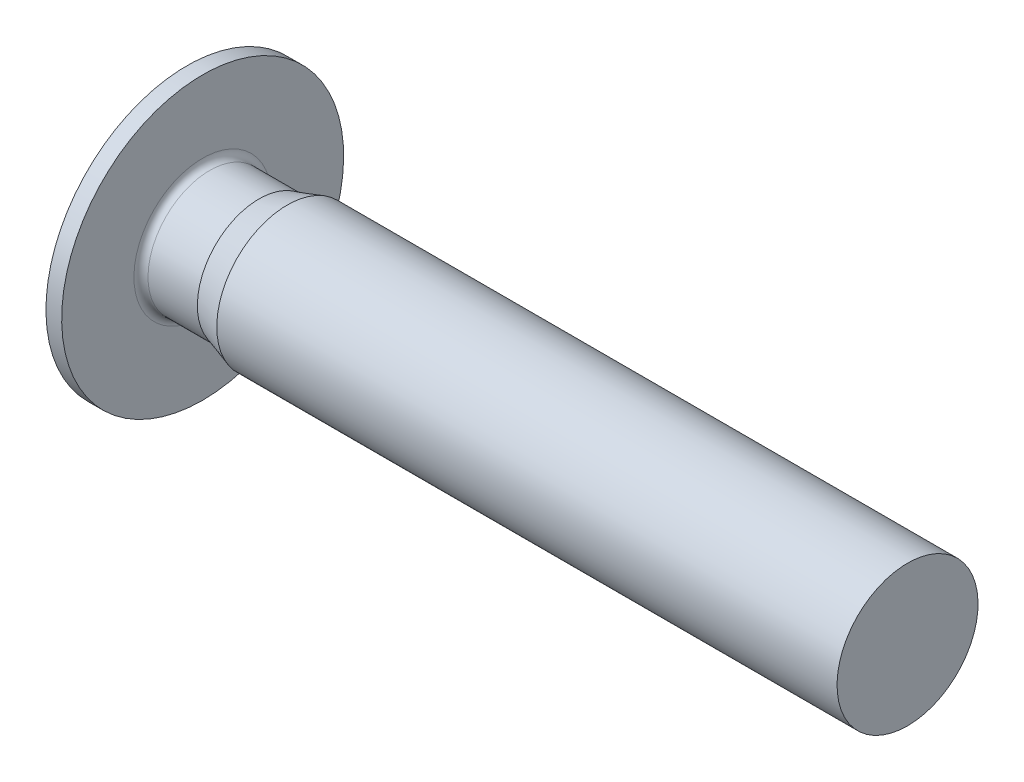
ISO-10303-21;
HEADER;
FILE_DESCRIPTION(('STEP AP214'),'2;1');
FILE_NAME('part.step','',(''),(''),'','','');
FILE_SCHEMA(('AUTOMOTIVE_DESIGN { 1 0 10303 214 1 1 1 1 }'));
ENDSEC;
DATA;
#1=APPLICATION_CONTEXT('core data for automotive mechanical design processes');
#2=APPLICATION_PROTOCOL_DEFINITION('international standard','automotive_design',2000,#1);
#3=PRODUCT_CONTEXT('',#1,'mechanical');
#4=PRODUCT('Part','Part','',(#3));
#5=PRODUCT_RELATED_PRODUCT_CATEGORY('part','',(#4));
#6=PRODUCT_DEFINITION_FORMATION('','',#4);
#7=PRODUCT_DEFINITION_CONTEXT('part definition',#1,'design');
#8=PRODUCT_DEFINITION('design','',#6,#7);
#9=PRODUCT_DEFINITION_SHAPE('','',#8);
#10=(LENGTH_UNIT() NAMED_UNIT(*) SI_UNIT(.MILLI.,.METRE.));
#11=(NAMED_UNIT(*) PLANE_ANGLE_UNIT() SI_UNIT($,.RADIAN.));
#12=(NAMED_UNIT(*) SI_UNIT($,.STERADIAN.) SOLID_ANGLE_UNIT());
#13=UNCERTAINTY_MEASURE_WITH_UNIT(LENGTH_MEASURE(1.E-05),#10,'distance_accuracy_value','');
#14=(GEOMETRIC_REPRESENTATION_CONTEXT(3) GLOBAL_UNCERTAINTY_ASSIGNED_CONTEXT((#13)) GLOBAL_UNIT_ASSIGNED_CONTEXT((#10,
#11,#12)) REPRESENTATION_CONTEXT('',''));
#15=CARTESIAN_POINT('',(0.,0.,0.));
#16=DIRECTION('',(0.,0.,1.));
#17=DIRECTION('',(1.,0.,0.));
#18=AXIS2_PLACEMENT_3D('',#15,#16,#17);
#19=CARTESIAN_POINT('',(0.7,0.,0.));
#20=DIRECTION('',(-1.,0.,0.));
#21=DIRECTION('',(0.,0.,1.));
#22=AXIS2_PLACEMENT_3D('',#19,#20,#21);
#23=PLANE('',#22);
#24=CARTESIAN_POINT('',(0.7,0.,0.));
#25=DIRECTION('',(-1.,0.,0.));
#26=DIRECTION('',(0.,-1.,0.));
#27=AXIS2_PLACEMENT_3D('',#24,#25,#26);
#28=CIRCLE('',#27,0.65);
#29=CARTESIAN_POINT('',(0.7,-0.562916512459885,0.325));
#30=VERTEX_POINT('',#29);
#31=CARTESIAN_POINT('',(0.7,0.,0.65));
#32=VERTEX_POINT('',#31);
#33=EDGE_CURVE('E58',#30,#32,#28,.T.);
#34=ORIENTED_EDGE('',*,*,#33,.F.);
#35=DIRECTION('',(0.,0.5,0.866025403784439));
#36=VECTOR('',#35,1.);
#37=CARTESIAN_POINT('',(0.7,-0.750555349946514,0.));
#38=LINE('',#37,#36);
#39=CARTESIAN_POINT('',(0.7,-0.375277674973257,0.65));
#40=VERTEX_POINT('',#39);
#41=EDGE_CURVE('E309',#30,#40,#38,.T.);
#42=ORIENTED_EDGE('',*,*,#41,.T.);
#43=DIRECTION('',(0.,1.,0.));
#44=VECTOR('',#43,1.);
#45=CARTESIAN_POINT('',(0.7,-0.375277674973257,0.65));
#46=LINE('',#45,#44);
#47=EDGE_CURVE('E261',#40,#32,#46,.T.);
#48=ORIENTED_EDGE('',*,*,#47,.T.);
#49=EDGE_LOOP('',(#34,#42,#48));
#50=FACE_BOUND('',#49,.T.);
#51=ADVANCED_FACE('F46',(#50),#23,.T.);
#52=CARTESIAN_POINT('',(0.7,0.562916512459885,0.325));
#53=VERTEX_POINT('',#52);
#54=EDGE_CURVE('E11',#32,#53,#28,.T.);
#55=ORIENTED_EDGE('',*,*,#54,.F.);
#56=CARTESIAN_POINT('',(0.7,0.375277674973257,0.65));
#57=VERTEX_POINT('',#56);
#58=EDGE_CURVE('E298',#32,#57,#46,.T.);
#59=ORIENTED_EDGE('',*,*,#58,.T.);
#60=DIRECTION('',(0.,0.5,-0.866025403784438));
#61=VECTOR('',#60,1.);
#62=CARTESIAN_POINT('',(0.7,0.375277674973257,0.65));
#63=LINE('',#62,#61);
#64=EDGE_CURVE('E328',#57,#53,#63,.T.);
#65=ORIENTED_EDGE('',*,*,#64,.T.);
#66=EDGE_LOOP('',(#55,#59,#65));
#67=FACE_BOUND('',#66,.T.);
#68=ADVANCED_FACE('F134',(#67),#23,.T.);
#69=CARTESIAN_POINT('',(0.7,0.562916512459885,-0.325));
#70=VERTEX_POINT('',#69);
#71=EDGE_CURVE('E56',#53,#70,#28,.T.);
#72=ORIENTED_EDGE('',*,*,#71,.F.);
#73=CARTESIAN_POINT('',(0.7,0.750555349946514,0.));
#74=VERTEX_POINT('',#73);
#75=EDGE_CURVE('E278',#53,#74,#63,.T.);
#76=ORIENTED_EDGE('',*,*,#75,.T.);
#77=DIRECTION('',(0.,-0.5,-0.866025403784439));
#78=VECTOR('',#77,1.);
#79=CARTESIAN_POINT('',(0.7,0.750555349946514,0.));
#80=LINE('',#79,#78);
#81=EDGE_CURVE('E324',#74,#70,#80,.T.);
#82=ORIENTED_EDGE('',*,*,#81,.T.);
#83=EDGE_LOOP('',(#72,#76,#82));
#84=FACE_BOUND('',#83,.T.);
#85=ADVANCED_FACE('F139',(#84),#23,.T.);
#86=CARTESIAN_POINT('',(0.7,0.,-0.65));
#87=VERTEX_POINT('',#86);
#88=EDGE_CURVE('E247',#70,#87,#28,.T.);
#89=ORIENTED_EDGE('',*,*,#88,.F.);
#90=CARTESIAN_POINT('',(0.7,0.375277674973257,-0.65));
#91=VERTEX_POINT('',#90);
#92=EDGE_CURVE('E327',#70,#91,#80,.T.);
#93=ORIENTED_EDGE('',*,*,#92,.T.);
#94=DIRECTION('',(0.,-1.,0.));
#95=VECTOR('',#94,1.);
#96=CARTESIAN_POINT('',(0.7,0.375277674973257,-0.65));
#97=LINE('',#96,#95);
#98=EDGE_CURVE('E319',#91,#87,#97,.T.);
#99=ORIENTED_EDGE('',*,*,#98,.T.);
#100=EDGE_LOOP('',(#89,#93,#99));
#101=FACE_BOUND('',#100,.T.);
#102=ADVANCED_FACE('F198',(#101),#23,.T.);
#103=CARTESIAN_POINT('',(0.7,-0.562916512459885,-0.325));
#104=VERTEX_POINT('',#103);
#105=EDGE_CURVE('E65',#87,#104,#28,.T.);
#106=ORIENTED_EDGE('',*,*,#105,.F.);
#107=CARTESIAN_POINT('',(0.7,-0.375277674973257,-0.65));
#108=VERTEX_POINT('',#107);
#109=EDGE_CURVE('E323',#87,#108,#97,.T.);
#110=ORIENTED_EDGE('',*,*,#109,.T.);
#111=DIRECTION('',(0.,-0.5,0.866025403784439));
#112=VECTOR('',#111,1.);
#113=CARTESIAN_POINT('',(0.7,-0.375277674973257,-0.65));
#114=LINE('',#113,#112);
#115=EDGE_CURVE('E313',#108,#104,#114,.T.);
#116=ORIENTED_EDGE('',*,*,#115,.T.);
#117=EDGE_LOOP('',(#106,#110,#116));
#118=FACE_BOUND('',#117,.T.);
#119=ADVANCED_FACE('F132',(#118),#23,.T.);
#120=CARTESIAN_POINT('',(-0.5,0.,0.));
#121=DIRECTION('',(-1.,0.,0.));
#122=DIRECTION('',(0.,-1.,0.));
#123=AXIS2_PLACEMENT_3D('',#120,#121,#122);
#124=CYLINDRICAL_SURFACE('',#123,0.875);
#125=CARTESIAN_POINT('',(0.1,0.,0.));
#126=DIRECTION('',(-1.,0.,0.));
#127=DIRECTION('',(0.,-1.,0.));
#128=AXIS2_PLACEMENT_3D('',#125,#126,#127);
#129=CIRCLE('',#128,0.875);
#130=CARTESIAN_POINT('',(0.1,-0.875,0.));
#131=VERTEX_POINT('',#130);
#132=EDGE_CURVE('E50',#131,#131,#129,.F.);
#133=ORIENTED_EDGE('',*,*,#132,.T.);
#134=EDGE_LOOP('',(#133));
#135=FACE_BOUND('',#134,.T.);
#136=CARTESIAN_POINT('',(0.8,0.,0.));
#137=DIRECTION('',(-1.,0.,0.));
#138=DIRECTION('',(0.,-1.,0.));
#139=AXIS2_PLACEMENT_3D('',#136,#137,#138);
#140=CIRCLE('',#139,0.875);
#141=CARTESIAN_POINT('',(0.8,-0.875,0.));
#142=VERTEX_POINT('',#141);
#143=EDGE_CURVE('E205',#142,#142,#140,.T.);
#144=ORIENTED_EDGE('',*,*,#143,.T.);
#145=EDGE_LOOP('',(#144));
#146=FACE_BOUND('',#145,.T.);
#147=ADVANCED_FACE('F191',(#135,#146),#124,.T.);
#148=CARTESIAN_POINT('',(0.,2.,0.));
#149=DIRECTION('',(-1.,0.,0.));
#150=DIRECTION('',(0.,-1.,0.));
#151=AXIS2_PLACEMENT_3D('',#148,#149,#150);
#152=PLANE('',#151);
#153=CARTESIAN_POINT('',(0.,0.,0.));
#154=DIRECTION('',(-1.,0.,0.));
#155=DIRECTION('',(0.,-1.,0.));
#156=AXIS2_PLACEMENT_3D('',#153,#154,#155);
#157=CIRCLE('',#156,0.975);
#158=CARTESIAN_POINT('',(0.,-0.975,0.));
#159=VERTEX_POINT('',#158);
#160=EDGE_CURVE('E236',#159,#159,#157,.T.);
#161=ORIENTED_EDGE('',*,*,#160,.T.);
#162=EDGE_LOOP('',(#161));
#163=FACE_BOUND('',#162,.T.);
#164=CARTESIAN_POINT('',(0.,0.,0.));
#165=DIRECTION('',(-1.,0.,0.));
#166=DIRECTION('',(0.,-1.,0.));
#167=AXIS2_PLACEMENT_3D('',#164,#165,#166);
#168=CIRCLE('',#167,2.);
#169=CARTESIAN_POINT('',(0.,-2.,0.));
#170=VERTEX_POINT('',#169);
#171=EDGE_CURVE('E233',#170,#170,#168,.T.);
#172=ORIENTED_EDGE('',*,*,#171,.F.);
#173=EDGE_LOOP('',(#172));
#174=FACE_BOUND('',#173,.T.);
#175=ADVANCED_FACE('F188',(#163,#174),#152,.F.);
#176=CARTESIAN_POINT('',(-0.5,0.,0.));
#177=DIRECTION('',(-1.,0.,0.));
#178=DIRECTION('',(0.,-1.,0.));
#179=AXIS2_PLACEMENT_3D('',#176,#177,#178);
#180=CYLINDRICAL_SURFACE('',#179,2.);
#181=CARTESIAN_POINT('',(-0.222871870788983,0.,0.));
#182=DIRECTION('',(-1.,0.,0.));
#183=DIRECTION('',(0.,-1.,0.));
#184=AXIS2_PLACEMENT_3D('',#181,#182,#183);
#185=CIRCLE('',#184,2.);
#186=CARTESIAN_POINT('',(-0.222871870788983,-2.,0.));
#187=VERTEX_POINT('',#186);
#188=EDGE_CURVE('E229',#187,#187,#185,.T.);
#189=ORIENTED_EDGE('',*,*,#188,.F.);
#190=EDGE_LOOP('',(#189));
#191=FACE_BOUND('',#190,.T.);
#192=ORIENTED_EDGE('',*,*,#171,.T.);
#193=EDGE_LOOP('',(#192));
#194=FACE_BOUND('',#193,.T.);
#195=ADVANCED_FACE('F184',(#191,#194),#180,.T.);
#196=CARTESIAN_POINT('',(-0.222871870788983,0.,0.));
#197=DIRECTION('',(1.,0.,0.));
#198=DIRECTION('',(0.,1.,0.));
#199=AXIS2_PLACEMENT_3D('',#196,#197,#198);
#200=CONICAL_SURFACE('',#199,2.,1.0471975511966);
#201=CARTESIAN_POINT('',(-0.5,0.,0.));
#202=DIRECTION('',(-1.,0.,0.));
#203=DIRECTION('',(0.,-1.,0.));
#204=AXIS2_PLACEMENT_3D('',#201,#202,#203);
#205=CIRCLE('',#204,1.52);
#206=CARTESIAN_POINT('',(-0.5,-1.52,0.));
#207=VERTEX_POINT('',#206);
#208=EDGE_CURVE('E225',#207,#207,#205,.T.);
#209=ORIENTED_EDGE('',*,*,#208,.F.);
#210=EDGE_LOOP('',(#209));
#211=FACE_BOUND('',#210,.T.);
#212=ORIENTED_EDGE('',*,*,#188,.T.);
#213=EDGE_LOOP('',(#212));
#214=FACE_BOUND('',#213,.T.);
#215=ADVANCED_FACE('F180',(#211,#214),#200,.T.);
#216=CARTESIAN_POINT('',(-0.5,0.,0.));
#217=DIRECTION('',(1.,0.,0.));
#218=DIRECTION('',(0.,1.,0.));
#219=AXIS2_PLACEMENT_3D('',#216,#217,#218);
#220=PLANE('',#219);
#221=DIRECTION('',(0.,-0.5,-0.866025403784439));
#222=VECTOR('',#221,1.);
#223=CARTESIAN_POINT('',(-0.5,0.750555349946514,0.));
#224=LINE('',#223,#222);
#225=CARTESIAN_POINT('',(-0.5,0.750555349946514,0.));
#226=VERTEX_POINT('',#225);
#227=CARTESIAN_POINT('',(-0.5,0.375277674973257,-0.65));
#228=VERTEX_POINT('',#227);
#229=EDGE_CURVE('E253',#226,#228,#224,.T.);
#230=ORIENTED_EDGE('',*,*,#229,.F.);
#231=DIRECTION('',(0.,0.5,-0.866025403784438));
#232=VECTOR('',#231,1.);
#233=CARTESIAN_POINT('',(-0.5,0.375277674973257,0.65));
#234=LINE('',#233,#232);
#235=CARTESIAN_POINT('',(-0.5,0.375277674973257,0.65));
#236=VERTEX_POINT('',#235);
#237=EDGE_CURVE('E73',#236,#226,#234,.T.);
#238=ORIENTED_EDGE('',*,*,#237,.F.);
#239=DIRECTION('',(0.,1.,0.));
#240=VECTOR('',#239,1.);
#241=CARTESIAN_POINT('',(-0.5,-0.375277674973257,0.65));
#242=LINE('',#241,#240);
#243=CARTESIAN_POINT('',(-0.5,-0.375277674973257,0.65));
#244=VERTEX_POINT('',#243);
#245=EDGE_CURVE('E275',#244,#236,#242,.T.);
#246=ORIENTED_EDGE('',*,*,#245,.F.);
#247=DIRECTION('',(0.,0.5,0.866025403784439));
#248=VECTOR('',#247,1.);
#249=CARTESIAN_POINT('',(-0.5,-0.750555349946514,0.));
#250=LINE('',#249,#248);
#251=CARTESIAN_POINT('',(-0.5,-0.750555349946514,0.));
#252=VERTEX_POINT('',#251);
#253=EDGE_CURVE('E271',#252,#244,#250,.T.);
#254=ORIENTED_EDGE('',*,*,#253,.F.);
#255=DIRECTION('',(0.,-0.5,0.866025403784439));
#256=VECTOR('',#255,1.);
#257=CARTESIAN_POINT('',(-0.5,-0.375277674973257,-0.65));
#258=LINE('',#257,#256);
#259=CARTESIAN_POINT('',(-0.5,-0.375277674973257,-0.65));
#260=VERTEX_POINT('',#259);
#261=EDGE_CURVE('E267',#260,#252,#258,.T.);
#262=ORIENTED_EDGE('',*,*,#261,.F.);
#263=DIRECTION('',(0.,-1.,0.));
#264=VECTOR('',#263,1.);
#265=CARTESIAN_POINT('',(-0.5,0.375277674973257,-0.65));
#266=LINE('',#265,#264);
#267=EDGE_CURVE('E258',#228,#260,#266,.T.);
#268=ORIENTED_EDGE('',*,*,#267,.F.);
#269=EDGE_LOOP('',(#230,#238,#246,#254,#262,#268));
#270=FACE_BOUND('',#269,.T.);
#271=ORIENTED_EDGE('',*,*,#208,.T.);
#272=EDGE_LOOP('',(#271));
#273=FACE_BOUND('',#272,.T.);
#274=ADVANCED_FACE('F176',(#270,#273),#220,.F.);
#275=CARTESIAN_POINT('',(10.,1.,0.));
#276=DIRECTION('',(-1.,0.,0.));
#277=DIRECTION('',(0.,-1.,0.));
#278=AXIS2_PLACEMENT_3D('',#275,#276,#277);
#279=PLANE('',#278);
#280=CARTESIAN_POINT('',(10.,0.,0.));
#281=DIRECTION('',(-1.,0.,0.));
#282=DIRECTION('',(0.,-1.,0.));
#283=AXIS2_PLACEMENT_3D('',#280,#281,#282);
#284=CIRCLE('',#283,1.);
#285=CARTESIAN_POINT('',(10.,-1.,0.));
#286=VERTEX_POINT('',#285);
#287=EDGE_CURVE('E214',#286,#286,#284,.T.);
#288=ORIENTED_EDGE('',*,*,#287,.F.);
#289=EDGE_LOOP('',(#288));
#290=FACE_BOUND('',#289,.T.);
#291=ADVANCED_FACE('F172',(#290),#279,.F.);
#292=CARTESIAN_POINT('',(-0.5,0.,0.));
#293=DIRECTION('',(-1.,0.,0.));
#294=DIRECTION('',(0.,-1.,0.));
#295=AXIS2_PLACEMENT_3D('',#292,#293,#294);
#296=CYLINDRICAL_SURFACE('',#295,1.);
#297=CARTESIAN_POINT('',(1.2,0.,0.));
#298=DIRECTION('',(-1.,0.,0.));
#299=DIRECTION('',(0.,-1.,0.));
#300=AXIS2_PLACEMENT_3D('',#297,#298,#299);
#301=CIRCLE('',#300,1.);
#302=CARTESIAN_POINT('',(1.2,-1.,0.));
#303=VERTEX_POINT('',#302);
#304=EDGE_CURVE('E207',#303,#303,#301,.T.);
#305=ORIENTED_EDGE('',*,*,#304,.F.);
#306=EDGE_LOOP('',(#305));
#307=FACE_BOUND('',#306,.T.);
#308=ORIENTED_EDGE('',*,*,#287,.T.);
#309=EDGE_LOOP('',(#308));
#310=FACE_BOUND('',#309,.T.);
#311=ADVANCED_FACE('F168',(#307,#310),#296,.T.);
#312=CARTESIAN_POINT('',(1.2,0.,0.));
#313=DIRECTION('',(1.,0.,0.));
#314=DIRECTION('',(0.,1.,0.));
#315=AXIS2_PLACEMENT_3D('',#312,#313,#314);
#316=CONICAL_SURFACE('',#315,1.,0.302884868374972);
#317=ORIENTED_EDGE('',*,*,#143,.F.);
#318=EDGE_LOOP('',(#317));
#319=FACE_BOUND('',#318,.T.);
#320=ORIENTED_EDGE('',*,*,#304,.T.);
#321=EDGE_LOOP('',(#320));
#322=FACE_BOUND('',#321,.T.);
#323=ADVANCED_FACE('F165',(#319,#322),#316,.T.);
#324=CARTESIAN_POINT('',(0.1,0.,0.));
#325=DIRECTION('',(-1.,0.,0.));
#326=DIRECTION('',(0.,-1.,0.));
#327=AXIS2_PLACEMENT_3D('',#324,#325,#326);
#328=TOROIDAL_SURFACE('',#327,0.975,0.1);
#329=ORIENTED_EDGE('',*,*,#132,.F.);
#330=EDGE_LOOP('',(#329));
#331=FACE_BOUND('',#330,.T.);
#332=ORIENTED_EDGE('',*,*,#160,.F.);
#333=EDGE_LOOP('',(#332));
#334=FACE_BOUND('',#333,.T.);
#335=ADVANCED_FACE('F48',(#331,#334),#328,.F.);
#336=CARTESIAN_POINT('',(0.7,0.375277674973257,0.65));
#337=DIRECTION('',(0.,0.866025403784439,0.5));
#338=DIRECTION('',(0.,-0.5,0.866025403784439));
#339=AXIS2_PLACEMENT_3D('',#336,#337,#338);
#340=PLANE('',#339);
#341=ORIENTED_EDGE('',*,*,#237,.T.);
#342=DIRECTION('',(-1.,0.,0.));
#343=VECTOR('',#342,1.);
#344=CARTESIAN_POINT('',(0.7,0.750555349946514,0.));
#345=LINE('',#344,#343);
#346=EDGE_CURVE('E219',#74,#226,#345,.T.);
#347=ORIENTED_EDGE('',*,*,#346,.F.);
#348=ORIENTED_EDGE('',*,*,#75,.F.);
#349=ORIENTED_EDGE('',*,*,#64,.F.);
#350=DIRECTION('',(-1.,0.,0.));
#351=VECTOR('',#350,1.);
#352=CARTESIAN_POINT('',(0.7,0.375277674973257,0.65));
#353=LINE('',#352,#351);
#354=EDGE_CURVE('E208',#57,#236,#353,.T.);
#355=ORIENTED_EDGE('',*,*,#354,.T.);
#356=EDGE_LOOP('',(#341,#347,#348,#349,#355));
#357=FACE_BOUND('',#356,.T.);
#358=ADVANCED_FACE('F147',(#357),#340,.F.);
#359=CARTESIAN_POINT('',(0.7,-0.375277674973257,0.65));
#360=DIRECTION('',(0.,0.,1.));
#361=DIRECTION('',(1.,0.,0.));
#362=AXIS2_PLACEMENT_3D('',#359,#360,#361);
#363=PLANE('',#362);
#364=ORIENTED_EDGE('',*,*,#245,.T.);
#365=ORIENTED_EDGE('',*,*,#354,.F.);
#366=ORIENTED_EDGE('',*,*,#58,.F.);
#367=ORIENTED_EDGE('',*,*,#47,.F.);
#368=DIRECTION('',(-1.,0.,0.));
#369=VECTOR('',#368,1.);
#370=CARTESIAN_POINT('',(0.7,-0.375277674973257,0.65));
#371=LINE('',#370,#369);
#372=EDGE_CURVE('E216',#40,#244,#371,.T.);
#373=ORIENTED_EDGE('',*,*,#372,.T.);
#374=EDGE_LOOP('',(#364,#365,#366,#367,#373));
#375=FACE_BOUND('',#374,.T.);
#376=ADVANCED_FACE('F143',(#375),#363,.F.);
#377=CARTESIAN_POINT('',(0.7,-0.750555349946514,0.));
#378=DIRECTION('',(0.,-0.866025403784439,0.5));
#379=DIRECTION('',(0.,-0.5,-0.866025403784439));
#380=AXIS2_PLACEMENT_3D('',#377,#378,#379);
#381=PLANE('',#380);
#382=ORIENTED_EDGE('',*,*,#253,.T.);
#383=ORIENTED_EDGE('',*,*,#372,.F.);
#384=ORIENTED_EDGE('',*,*,#41,.F.);
#385=CARTESIAN_POINT('',(0.7,-0.750555349946514,0.));
#386=VERTEX_POINT('',#385);
#387=EDGE_CURVE('E302',#386,#30,#38,.T.);
#388=ORIENTED_EDGE('',*,*,#387,.F.);
#389=DIRECTION('',(-1.,0.,0.));
#390=VECTOR('',#389,1.);
#391=CARTESIAN_POINT('',(0.7,-0.750555349946514,0.));
#392=LINE('',#391,#390);
#393=EDGE_CURVE('E282',#386,#252,#392,.T.);
#394=ORIENTED_EDGE('',*,*,#393,.T.);
#395=EDGE_LOOP('',(#382,#383,#384,#388,#394));
#396=FACE_BOUND('',#395,.T.);
#397=ADVANCED_FACE('F146',(#396),#381,.F.);
#398=CARTESIAN_POINT('',(0.7,-0.375277674973257,-0.65));
#399=DIRECTION('',(0.,-0.866025403784439,-0.5));
#400=DIRECTION('',(0.,0.5,-0.866025403784439));
#401=AXIS2_PLACEMENT_3D('',#398,#399,#400);
#402=PLANE('',#401);
#403=ORIENTED_EDGE('',*,*,#261,.T.);
#404=ORIENTED_EDGE('',*,*,#393,.F.);
#405=EDGE_CURVE('E318',#104,#386,#114,.T.);
#406=ORIENTED_EDGE('',*,*,#405,.F.);
#407=ORIENTED_EDGE('',*,*,#115,.F.);
#408=DIRECTION('',(-1.,0.,0.));
#409=VECTOR('',#408,1.);
#410=CARTESIAN_POINT('',(0.7,-0.375277674973257,-0.65));
#411=LINE('',#410,#409);
#412=EDGE_CURVE('E285',#108,#260,#411,.T.);
#413=ORIENTED_EDGE('',*,*,#412,.T.);
#414=EDGE_LOOP('',(#403,#404,#406,#407,#413));
#415=FACE_BOUND('',#414,.T.);
#416=ADVANCED_FACE('F151',(#415),#402,.F.);
#417=CARTESIAN_POINT('',(0.7,0.375277674973257,-0.65));
#418=DIRECTION('',(0.,0.,-1.));
#419=DIRECTION('',(0.,1.,0.));
#420=AXIS2_PLACEMENT_3D('',#417,#418,#419);
#421=PLANE('',#420);
#422=ORIENTED_EDGE('',*,*,#267,.T.);
#423=ORIENTED_EDGE('',*,*,#412,.F.);
#424=ORIENTED_EDGE('',*,*,#109,.F.);
#425=ORIENTED_EDGE('',*,*,#98,.F.);
#426=DIRECTION('',(-1.,0.,0.));
#427=VECTOR('',#426,1.);
#428=CARTESIAN_POINT('',(0.7,0.375277674973257,-0.65));
#429=LINE('',#428,#427);
#430=EDGE_CURVE('E287',#91,#228,#429,.T.);
#431=ORIENTED_EDGE('',*,*,#430,.T.);
#432=EDGE_LOOP('',(#422,#423,#424,#425,#431));
#433=FACE_BOUND('',#432,.T.);
#434=ADVANCED_FACE('F155',(#433),#421,.F.);
#435=CARTESIAN_POINT('',(0.7,0.750555349946514,0.));
#436=DIRECTION('',(0.,0.866025403784439,-0.5));
#437=DIRECTION('',(0.,0.5,0.866025403784439));
#438=AXIS2_PLACEMENT_3D('',#435,#436,#437);
#439=PLANE('',#438);
#440=ORIENTED_EDGE('',*,*,#229,.T.);
#441=ORIENTED_EDGE('',*,*,#430,.F.);
#442=ORIENTED_EDGE('',*,*,#92,.F.);
#443=ORIENTED_EDGE('',*,*,#81,.F.);
#444=ORIENTED_EDGE('',*,*,#346,.T.);
#445=EDGE_LOOP('',(#440,#441,#442,#443,#444));
#446=FACE_BOUND('',#445,.T.);
#447=ADVANCED_FACE('F129',(#446),#439,.F.);
#448=EDGE_CURVE('E242',#104,#30,#28,.T.);
#449=ORIENTED_EDGE('',*,*,#448,.F.);
#450=ORIENTED_EDGE('',*,*,#405,.T.);
#451=ORIENTED_EDGE('',*,*,#387,.T.);
#452=EDGE_LOOP('',(#449,#450,#451));
#453=FACE_BOUND('',#452,.T.);
#454=ADVANCED_FACE('F124',(#453),#23,.T.);
#455=CARTESIAN_POINT('',(1.09055940236791,0.,0.));
#456=DIRECTION('',(-1.,0.,0.));
#457=DIRECTION('',(0.,-1.,0.));
#458=AXIS2_PLACEMENT_3D('',#455,#456,#457);
#459=CONICAL_SURFACE('',#458,0.,1.02974425867666);
#460=ORIENTED_EDGE('',*,*,#33,.T.);
#461=ORIENTED_EDGE('',*,*,#54,.T.);
#462=ORIENTED_EDGE('',*,*,#71,.T.);
#463=ORIENTED_EDGE('',*,*,#88,.T.);
#464=ORIENTED_EDGE('',*,*,#105,.T.);
#465=ORIENTED_EDGE('',*,*,#448,.T.);
#466=EDGE_LOOP('',(#460,#461,#462,#463,#464,#465));
#467=FACE_BOUND('',#466,.T.);
#468=CARTESIAN_POINT('',(1.09055940236791,0.,0.));
#469=VERTEX_POINT('',#468);
#470=VERTEX_LOOP('',#469);
#471=FACE_BOUND('',#470,.T.);
#472=ADVANCED_FACE('F122',(#467,#471),#459,.F.);
#473=CLOSED_SHELL('',(#51,#68,#85,#102,#119,#147,#175,#195,#215,#274,#291,#311,#323,#335,#358,
#376,#397,#416,#434,#447,#454,#472));
#474=MANIFOLD_SOLID_BREP('B2',#473);
#475=ADVANCED_BREP_SHAPE_REPRESENTATION('',(#18,#474),#14);
#476=SHAPE_DEFINITION_REPRESENTATION(#9,#475);
ENDSEC;
END-ISO-10303-21;
